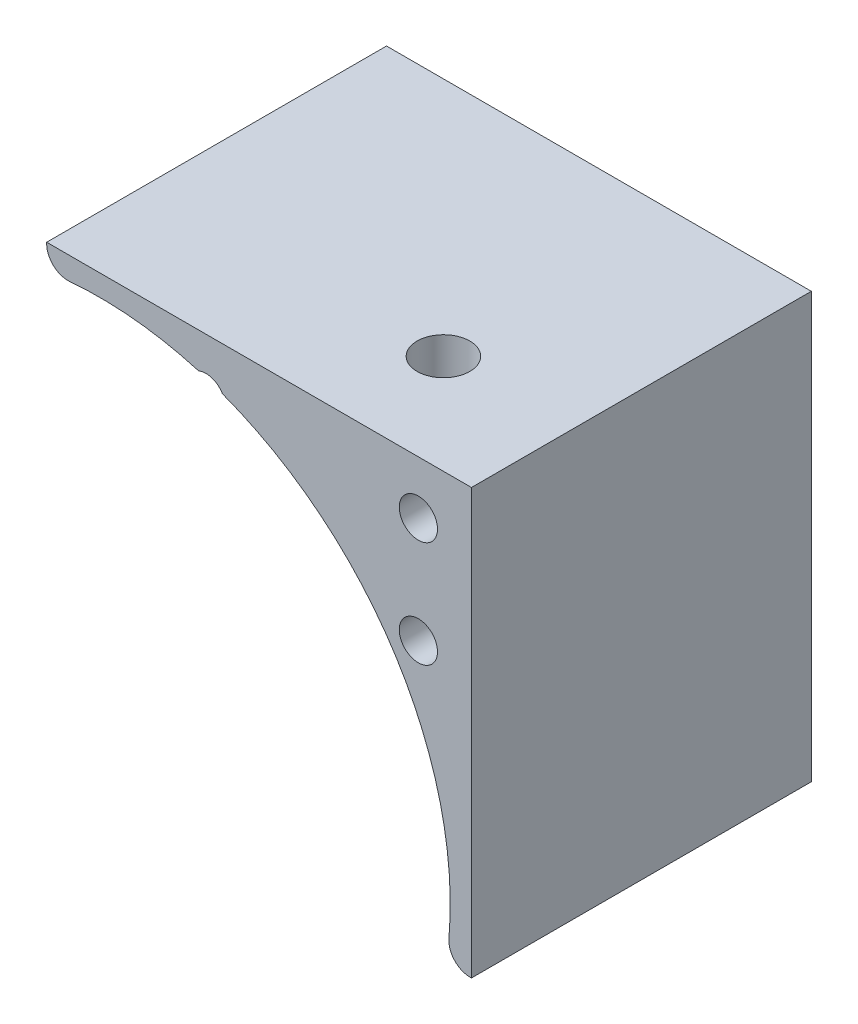
ISO-10303-21;
HEADER;
FILE_DESCRIPTION(('STEP AP214'),'2;1');
FILE_NAME('part.step','',(''),(''),'','','');
FILE_SCHEMA(('AUTOMOTIVE_DESIGN { 1 0 10303 214 1 1 1 1 }'));
ENDSEC;
DATA;
#1=APPLICATION_CONTEXT('core data for automotive mechanical design processes');
#2=APPLICATION_PROTOCOL_DEFINITION('international standard','automotive_design',2000,#1);
#3=PRODUCT_CONTEXT('',#1,'mechanical');
#4=PRODUCT('Part','Part','',(#3));
#5=PRODUCT_RELATED_PRODUCT_CATEGORY('part','',(#4));
#6=PRODUCT_DEFINITION_FORMATION('','',#4);
#7=PRODUCT_DEFINITION_CONTEXT('part definition',#1,'design');
#8=PRODUCT_DEFINITION('design','',#6,#7);
#9=PRODUCT_DEFINITION_SHAPE('','',#8);
#10=(LENGTH_UNIT() NAMED_UNIT(*) SI_UNIT(.MILLI.,.METRE.));
#11=(NAMED_UNIT(*) PLANE_ANGLE_UNIT() SI_UNIT($,.RADIAN.));
#12=(NAMED_UNIT(*) SI_UNIT($,.STERADIAN.) SOLID_ANGLE_UNIT());
#13=UNCERTAINTY_MEASURE_WITH_UNIT(LENGTH_MEASURE(1.E-05),#10,'distance_accuracy_value','');
#14=(GEOMETRIC_REPRESENTATION_CONTEXT(3) GLOBAL_UNCERTAINTY_ASSIGNED_CONTEXT((#13)) GLOBAL_UNIT_ASSIGNED_CONTEXT((#10,
#11,#12)) REPRESENTATION_CONTEXT('',''));
#15=CARTESIAN_POINT('',(0.,0.,0.));
#16=DIRECTION('',(0.,0.,1.));
#17=DIRECTION('',(1.,0.,0.));
#18=AXIS2_PLACEMENT_3D('',#15,#16,#17);
#19=CARTESIAN_POINT('',(6.34999999999708,6.35000000000727,13.97));
#20=DIRECTION('',(0.,0.,1.));
#21=DIRECTION('',(1.,0.,0.));
#22=AXIS2_PLACEMENT_3D('',#19,#20,#21);
#23=CYLINDRICAL_SURFACE('',#22,41.91);
#24=CARTESIAN_POINT('',(6.34999999999708,6.35000000000727,40.64));
#25=DIRECTION('',(0.,0.,-1.));
#26=DIRECTION('',(-1.,0.,0.));
#27=AXIS2_PLACEMENT_3D('',#24,#25,#26);
#28=CIRCLE('',#27,41.91);
#29=CARTESIAN_POINT('',(2.75771428571412,48.1057610797308,40.64));
#30=VERTEX_POINT('',#29);
#31=CARTESIAN_POINT('',(18.168339966931,46.5591400110293,40.64));
#32=VERTEX_POINT('',#31);
#33=EDGE_CURVE('E139',#30,#32,#28,.T.);
#34=ORIENTED_EDGE('',*,*,#33,.F.);
#35=DIRECTION('',(0.,0.,1.));
#36=VECTOR('',#35,1.);
#37=CARTESIAN_POINT('',(2.75771428571412,48.1057610797308,13.97));
#38=LINE('',#37,#36);
#39=CARTESIAN_POINT('',(2.75771428571412,48.1057610797308,13.97));
#40=VERTEX_POINT('',#39);
#41=EDGE_CURVE('E202',#30,#40,#38,.F.);
#42=ORIENTED_EDGE('',*,*,#41,.T.);
#43=CARTESIAN_POINT('',(6.34999999999708,6.35000000000727,13.97));
#44=DIRECTION('',(0.,0.,1.));
#45=DIRECTION('',(1.,0.,0.));
#46=AXIS2_PLACEMENT_3D('',#43,#44,#45);
#47=CIRCLE('',#46,41.91);
#48=CARTESIAN_POINT('',(18.1683399669311,46.5591400110293,13.97));
#49=VERTEX_POINT('',#48);
#50=EDGE_CURVE('E165',#49,#40,#47,.T.);
#51=ORIENTED_EDGE('',*,*,#50,.F.);
#52=DIRECTION('',(0.,0.,-1.));
#53=VECTOR('',#52,1.);
#54=CARTESIAN_POINT('',(18.1683399669311,46.5591400110293,20.32));
#55=LINE('',#54,#53);
#56=EDGE_CURVE('E156',#49,#32,#55,.F.);
#57=ORIENTED_EDGE('',*,*,#56,.T.);
#58=EDGE_LOOP('',(#34,#42,#51,#57));
#59=FACE_BOUND('',#58,.T.);
#60=ADVANCED_FACE('F37',(#59),#23,.F.);
#61=CARTESIAN_POINT('',(0.,0.,40.64));
#62=DIRECTION('',(1.,0.,0.));
#63=DIRECTION('',(0.,0.,-1.));
#64=AXIS2_PLACEMENT_3D('',#61,#62,#63);
#65=PLANE('',#64);
#66=DIRECTION('',(0.,-1.,0.));
#67=VECTOR('',#66,1.);
#68=CARTESIAN_POINT('',(0.,0.,13.97));
#69=LINE('',#68,#67);
#70=CARTESIAN_POINT('',(0.,50.6364132663808,13.97));
#71=VERTEX_POINT('',#70);
#72=CARTESIAN_POINT('',(0.,37.8705710608244,13.97));
#73=VERTEX_POINT('',#72);
#74=EDGE_CURVE('E58',#71,#73,#69,.T.);
#75=ORIENTED_EDGE('',*,*,#74,.F.);
#76=DIRECTION('',(0.,0.,1.));
#77=VECTOR('',#76,1.);
#78=CARTESIAN_POINT('',(0.,50.6364132663808,40.64));
#79=LINE('',#78,#77);
#80=CARTESIAN_POINT('',(0.,50.6364132663808,40.64));
#81=VERTEX_POINT('',#80);
#82=EDGE_CURVE('E200',#71,#81,#79,.T.);
#83=ORIENTED_EDGE('',*,*,#82,.T.);
#84=DIRECTION('',(0.,-1.,0.));
#85=VECTOR('',#84,1.);
#86=CARTESIAN_POINT('',(0.,0.,40.64));
#87=LINE('',#86,#85);
#88=CARTESIAN_POINT('',(0.,50.8,40.64));
#89=VERTEX_POINT('',#88);
#90=EDGE_CURVE('E228',#89,#81,#87,.T.);
#91=ORIENTED_EDGE('',*,*,#90,.F.);
#92=DIRECTION('',(0.,0.,-1.));
#93=VECTOR('',#92,1.);
#94=CARTESIAN_POINT('',(0.,50.8,40.64));
#95=LINE('',#94,#93);
#96=CARTESIAN_POINT('',(0.,50.8,0.));
#97=VERTEX_POINT('',#96);
#98=EDGE_CURVE('E237',#89,#97,#95,.T.);
#99=ORIENTED_EDGE('',*,*,#98,.T.);
#100=DIRECTION('',(0.,-1.,0.));
#101=VECTOR('',#100,1.);
#102=CARTESIAN_POINT('',(0.,0.,0.));
#103=LINE('',#102,#101);
#104=CARTESIAN_POINT('',(0.,37.8705710608244,0.));
#105=VERTEX_POINT('',#104);
#106=EDGE_CURVE('E238',#97,#105,#103,.T.);
#107=ORIENTED_EDGE('',*,*,#106,.T.);
#108=DIRECTION('',(0.,0.,-1.));
#109=VECTOR('',#108,1.);
#110=CARTESIAN_POINT('',(0.,37.8705710608244,40.64));
#111=LINE('',#110,#109);
#112=EDGE_CURVE('E198',#105,#73,#111,.F.);
#113=ORIENTED_EDGE('',*,*,#112,.T.);
#114=EDGE_LOOP('',(#75,#83,#91,#99,#107,#113));
#115=FACE_BOUND('',#114,.T.);
#116=ADVANCED_FACE('F265',(#115),#65,.F.);
#117=CARTESIAN_POINT('',(0.,0.,40.64));
#118=DIRECTION('',(0.,1.,0.));
#119=DIRECTION('',(0.,0.,1.));
#120=AXIS2_PLACEMENT_3D('',#117,#118,#119);
#121=PLANE('',#120);
#122=DIRECTION('',(1.,0.,0.));
#123=VECTOR('',#122,1.);
#124=CARTESIAN_POINT('',(0.,0.,40.64));
#125=LINE('',#124,#123);
#126=CARTESIAN_POINT('',(50.6364132663697,0.,40.64));
#127=VERTEX_POINT('',#126);
#128=CARTESIAN_POINT('',(50.8,0.,40.64));
#129=VERTEX_POINT('',#128);
#130=EDGE_CURVE('E220',#127,#129,#125,.T.);
#131=ORIENTED_EDGE('',*,*,#130,.F.);
#132=DIRECTION('',(0.,0.,1.));
#133=VECTOR('',#132,1.);
#134=CARTESIAN_POINT('',(50.6364132663697,0.,40.64));
#135=LINE('',#134,#133);
#136=CARTESIAN_POINT('',(50.6364132663697,0.,13.97));
#137=VERTEX_POINT('',#136);
#138=EDGE_CURVE('E169',#127,#137,#135,.F.);
#139=ORIENTED_EDGE('',*,*,#138,.T.);
#140=DIRECTION('',(1.,0.,0.));
#141=VECTOR('',#140,1.);
#142=CARTESIAN_POINT('',(0.,0.,13.97));
#143=LINE('',#142,#141);
#144=CARTESIAN_POINT('',(37.870571060813,0.,13.97));
#145=VERTEX_POINT('',#144);
#146=EDGE_CURVE('E150',#145,#137,#143,.T.);
#147=ORIENTED_EDGE('',*,*,#146,.F.);
#148=DIRECTION('',(0.,0.,-1.));
#149=VECTOR('',#148,1.);
#150=CARTESIAN_POINT('',(37.870571060813,0.,40.64));
#151=LINE('',#150,#149);
#152=CARTESIAN_POINT('',(37.870571060813,0.,0.));
#153=VERTEX_POINT('',#152);
#154=EDGE_CURVE('E166',#145,#153,#151,.T.);
#155=ORIENTED_EDGE('',*,*,#154,.T.);
#156=DIRECTION('',(1.,0.,0.));
#157=VECTOR('',#156,1.);
#158=CARTESIAN_POINT('',(0.,0.,0.));
#159=LINE('',#158,#157);
#160=CARTESIAN_POINT('',(50.8,0.,0.));
#161=VERTEX_POINT('',#160);
#162=EDGE_CURVE('E241',#153,#161,#159,.T.);
#163=ORIENTED_EDGE('',*,*,#162,.T.);
#164=DIRECTION('',(0.,0.,-1.));
#165=VECTOR('',#164,1.);
#166=CARTESIAN_POINT('',(50.8,0.,40.64));
#167=LINE('',#166,#165);
#168=EDGE_CURVE('E225',#129,#161,#167,.T.);
#169=ORIENTED_EDGE('',*,*,#168,.F.);
#170=EDGE_LOOP('',(#131,#139,#147,#155,#163,#169));
#171=FACE_BOUND('',#170,.T.);
#172=ADVANCED_FACE('F223',(#171),#121,.F.);
#173=CARTESIAN_POINT('',(50.8,0.,40.64));
#174=DIRECTION('',(-1.,0.,0.));
#175=DIRECTION('',(0.,0.,1.));
#176=AXIS2_PLACEMENT_3D('',#173,#174,#175);
#177=PLANE('',#176);
#178=DIRECTION('',(0.,1.,0.));
#179=VECTOR('',#178,1.);
#180=CARTESIAN_POINT('',(50.8,0.,0.));
#181=LINE('',#180,#179);
#182=CARTESIAN_POINT('',(50.8,50.8,0.));
#183=VERTEX_POINT('',#182);
#184=EDGE_CURVE('E243',#161,#183,#181,.T.);
#185=ORIENTED_EDGE('',*,*,#184,.T.);
#186=DIRECTION('',(0.,0.,-1.));
#187=VECTOR('',#186,1.);
#188=CARTESIAN_POINT('',(50.8,50.8,40.64));
#189=LINE('',#188,#187);
#190=CARTESIAN_POINT('',(50.8,50.8,40.64));
#191=VERTEX_POINT('',#190);
#192=EDGE_CURVE('E248',#191,#183,#189,.T.);
#193=ORIENTED_EDGE('',*,*,#192,.F.);
#194=DIRECTION('',(0.,1.,0.));
#195=VECTOR('',#194,1.);
#196=CARTESIAN_POINT('',(50.8,0.,40.64));
#197=LINE('',#196,#195);
#198=EDGE_CURVE('E227',#129,#191,#197,.T.);
#199=ORIENTED_EDGE('',*,*,#198,.F.);
#200=ORIENTED_EDGE('',*,*,#168,.T.);
#201=EDGE_LOOP('',(#185,#193,#199,#200));
#202=FACE_BOUND('',#201,.T.);
#203=ADVANCED_FACE('F274',(#202),#177,.F.);
#204=CARTESIAN_POINT('',(0.,50.8,40.64));
#205=DIRECTION('',(0.,-1.,0.));
#206=DIRECTION('',(0.,0.,-1.));
#207=AXIS2_PLACEMENT_3D('',#204,#205,#206);
#208=PLANE('',#207);
#209=CARTESIAN_POINT('',(35.5320912711558,50.8,28.7241298478389));
#210=DIRECTION('',(0.,1.,0.));
#211=DIRECTION('',(0.,0.,1.));
#212=AXIS2_PLACEMENT_3D('',#209,#210,#211);
#213=CIRCLE('',#212,3.1543270941562);
#214=CARTESIAN_POINT('',(35.5320912711558,50.8,31.8784569419951));
#215=VERTEX_POINT('',#214);
#216=EDGE_CURVE('E304',#215,#215,#213,.T.);
#217=ORIENTED_EDGE('',*,*,#216,.F.);
#218=EDGE_LOOP('',(#217));
#219=FACE_BOUND('',#218,.T.);
#220=DIRECTION('',(-1.,0.,0.));
#221=VECTOR('',#220,1.);
#222=CARTESIAN_POINT('',(0.,50.8,0.));
#223=LINE('',#222,#221);
#224=EDGE_CURVE('E232',#183,#97,#223,.T.);
#225=ORIENTED_EDGE('',*,*,#224,.T.);
#226=ORIENTED_EDGE('',*,*,#98,.F.);
#227=DIRECTION('',(-1.,0.,0.));
#228=VECTOR('',#227,1.);
#229=CARTESIAN_POINT('',(0.,50.8,40.64));
#230=LINE('',#229,#228);
#231=EDGE_CURVE('E230',#191,#89,#230,.T.);
#232=ORIENTED_EDGE('',*,*,#231,.F.);
#233=ORIENTED_EDGE('',*,*,#192,.T.);
#234=EDGE_LOOP('',(#225,#226,#232,#233));
#235=FACE_BOUND('',#234,.T.);
#236=ADVANCED_FACE('F270',(#219,#235),#208,.F.);
#237=CARTESIAN_POINT('',(0.,0.,40.64));
#238=DIRECTION('',(0.,0.,-1.));
#239=DIRECTION('',(-1.,0.,0.));
#240=AXIS2_PLACEMENT_3D('',#237,#238,#239);
#241=PLANE('',#240);
#242=CARTESIAN_POINT('',(44.4499999999971,44.4500000000073,40.64));
#243=DIRECTION('',(0.,0.,-1.));
#244=DIRECTION('',(-1.,0.,0.));
#245=AXIS2_PLACEMENT_3D('',#242,#243,#244);
#246=CIRCLE('',#245,2.28599999999999);
#247=CARTESIAN_POINT('',(42.1639999999971,44.4500000000073,40.64));
#248=VERTEX_POINT('',#247);
#249=EDGE_CURVE('E320',#248,#248,#246,.T.);
#250=ORIENTED_EDGE('',*,*,#249,.T.);
#251=EDGE_LOOP('',(#250));
#252=FACE_BOUND('',#251,.T.);
#253=CARTESIAN_POINT('',(44.4499999999971,31.7500000000073,40.64));
#254=DIRECTION('',(0.,0.,-1.));
#255=DIRECTION('',(-1.,0.,0.));
#256=AXIS2_PLACEMENT_3D('',#253,#254,#255);
#257=CIRCLE('',#256,2.28599999999999);
#258=CARTESIAN_POINT('',(42.1639999999971,31.7500000000073,40.64));
#259=VERTEX_POINT('',#258);
#260=EDGE_CURVE('E303',#259,#259,#257,.T.);
#261=ORIENTED_EDGE('',*,*,#260,.T.);
#262=EDGE_LOOP('',(#261));
#263=FACE_BOUND('',#262,.T.);
#264=CARTESIAN_POINT('',(21.0208120330631,45.6083159889853,40.64));
#265=VERTEX_POINT('',#264);
#266=CARTESIAN_POINT('',(48.1057610797198,2.7577142857147,40.64));
#267=VERTEX_POINT('',#266);
#268=EDGE_CURVE('E151',#265,#267,#28,.T.);
#269=ORIENTED_EDGE('',*,*,#268,.T.);
#270=CARTESIAN_POINT('',(50.6364132663697,2.54,40.64));
#271=DIRECTION('',(0.,0.,-1.));
#272=DIRECTION('',(-1.,0.,0.));
#273=AXIS2_PLACEMENT_3D('',#270,#271,#272);
#274=CIRCLE('',#273,2.54);
#275=EDGE_CURVE('E185',#267,#127,#274,.F.);
#276=ORIENTED_EDGE('',*,*,#275,.T.);
#277=ORIENTED_EDGE('',*,*,#130,.T.);
#278=ORIENTED_EDGE('',*,*,#198,.T.);
#279=ORIENTED_EDGE('',*,*,#231,.T.);
#280=ORIENTED_EDGE('',*,*,#90,.T.);
#281=CARTESIAN_POINT('',(2.54,50.6364132663808,40.64));
#282=DIRECTION('',(0.,0.,-1.));
#283=DIRECTION('',(-1.,0.,0.));
#284=AXIS2_PLACEMENT_3D('',#281,#282,#283);
#285=CIRCLE('',#284,2.54);
#286=EDGE_CURVE('E146',#81,#30,#285,.F.);
#287=ORIENTED_EDGE('',*,*,#286,.T.);
#288=ORIENTED_EDGE('',*,*,#33,.T.);
#289=CARTESIAN_POINT('',(19.0499999999971,44.4500000000073,40.64));
#290=DIRECTION('',(0.,0.,-1.));
#291=DIRECTION('',(-1.,0.,0.));
#292=AXIS2_PLACEMENT_3D('',#289,#290,#291);
#293=CIRCLE('',#292,2.286);
#294=EDGE_CURVE('E143',#32,#265,#293,.T.);
#295=ORIENTED_EDGE('',*,*,#294,.T.);
#296=EDGE_LOOP('',(#269,#276,#277,#278,#279,#280,#287,#288,#295));
#297=FACE_BOUND('',#296,.T.);
#298=ADVANCED_FACE('F142',(#252,#263,#297),#241,.F.);
#299=CARTESIAN_POINT('',(0.,0.,0.));
#300=DIRECTION('',(0.,0.,-1.));
#301=DIRECTION('',(-1.,0.,0.));
#302=AXIS2_PLACEMENT_3D('',#299,#300,#301);
#303=PLANE('',#302);
#304=CARTESIAN_POINT('',(6.34999999999707,44.4500000000073,0.));
#305=DIRECTION('',(0.,0.,-1.));
#306=DIRECTION('',(-1.,0.,0.));
#307=AXIS2_PLACEMENT_3D('',#304,#305,#306);
#308=CIRCLE('',#307,2.286);
#309=CARTESIAN_POINT('',(4.06399999999707,44.4500000000073,0.));
#310=VERTEX_POINT('',#309);
#311=EDGE_CURVE('E313',#310,#310,#308,.T.);
#312=ORIENTED_EDGE('',*,*,#311,.F.);
#313=EDGE_LOOP('',(#312));
#314=FACE_BOUND('',#313,.T.);
#315=CARTESIAN_POINT('',(19.0499999999971,44.4500000000073,0.));
#316=DIRECTION('',(0.,0.,-1.));
#317=DIRECTION('',(-1.,0.,0.));
#318=AXIS2_PLACEMENT_3D('',#315,#316,#317);
#319=CIRCLE('',#318,2.286);
#320=CARTESIAN_POINT('',(16.7639999999971,44.4500000000073,0.));
#321=VERTEX_POINT('',#320);
#322=EDGE_CURVE('E160',#321,#321,#319,.T.);
#323=ORIENTED_EDGE('',*,*,#322,.F.);
#324=EDGE_LOOP('',(#323));
#325=FACE_BOUND('',#324,.T.);
#326=CARTESIAN_POINT('',(44.4499999999971,44.4500000000073,0.));
#327=DIRECTION('',(0.,0.,-1.));
#328=DIRECTION('',(-1.,0.,0.));
#329=AXIS2_PLACEMENT_3D('',#326,#327,#328);
#330=CIRCLE('',#329,2.28599999999999);
#331=CARTESIAN_POINT('',(42.1639999999971,44.4500000000073,0.));
#332=VERTEX_POINT('',#331);
#333=EDGE_CURVE('E161',#332,#332,#330,.T.);
#334=ORIENTED_EDGE('',*,*,#333,.F.);
#335=EDGE_LOOP('',(#334));
#336=FACE_BOUND('',#335,.T.);
#337=CARTESIAN_POINT('',(44.4499999999971,31.7500000000073,0.));
#338=DIRECTION('',(0.,0.,-1.));
#339=DIRECTION('',(-1.,0.,0.));
#340=AXIS2_PLACEMENT_3D('',#337,#338,#339);
#341=CIRCLE('',#340,2.28599999999999);
#342=CARTESIAN_POINT('',(42.1639999999971,31.7500000000073,0.));
#343=VERTEX_POINT('',#342);
#344=EDGE_CURVE('E306',#343,#343,#341,.T.);
#345=ORIENTED_EDGE('',*,*,#344,.F.);
#346=EDGE_LOOP('',(#345));
#347=FACE_BOUND('',#346,.T.);
#348=ORIENTED_EDGE('',*,*,#162,.F.);
#349=CARTESIAN_POINT('',(37.870571060813,2.54,0.));
#350=DIRECTION('',(0.,0.,-1.));
#351=DIRECTION('',(-1.,0.,0.));
#352=AXIS2_PLACEMENT_3D('',#349,#350,#351);
#353=CIRCLE('',#352,2.54);
#354=CARTESIAN_POINT('',(35.3489253759477,2.84480000000058,0.));
#355=VERTEX_POINT('',#354);
#356=EDGE_CURVE('E189',#153,#355,#353,.T.);
#357=ORIENTED_EDGE('',*,*,#356,.T.);
#358=CARTESIAN_POINT('',(6.34999999999707,6.35000000000727,0.));
#359=DIRECTION('',(0.,0.,-1.));
#360=DIRECTION('',(-1.,0.,0.));
#361=AXIS2_PLACEMENT_3D('',#358,#359,#360);
#362=CIRCLE('',#361,29.21);
#363=CARTESIAN_POINT('',(2.84479999999977,35.348925375959,0.));
#364=VERTEX_POINT('',#363);
#365=EDGE_CURVE('E177',#364,#355,#362,.T.);
#366=ORIENTED_EDGE('',*,*,#365,.F.);
#367=CARTESIAN_POINT('',(2.54,37.8705710608244,0.));
#368=DIRECTION('',(0.,0.,-1.));
#369=DIRECTION('',(-1.,0.,0.));
#370=AXIS2_PLACEMENT_3D('',#367,#368,#369);
#371=CIRCLE('',#370,2.54);
#372=EDGE_CURVE('E187',#364,#105,#371,.T.);
#373=ORIENTED_EDGE('',*,*,#372,.T.);
#374=ORIENTED_EDGE('',*,*,#106,.F.);
#375=ORIENTED_EDGE('',*,*,#224,.F.);
#376=ORIENTED_EDGE('',*,*,#184,.F.);
#377=EDGE_LOOP('',(#348,#357,#366,#373,#374,#375,#376));
#378=FACE_BOUND('',#377,.T.);
#379=ADVANCED_FACE('F263',(#314,#325,#336,#347,#378),#303,.T.);
#380=CARTESIAN_POINT('',(6.34999999999708,6.35000000000727,13.97));
#381=DIRECTION('',(0.,0.,1.));
#382=DIRECTION('',(1.,0.,0.));
#383=AXIS2_PLACEMENT_3D('',#380,#381,#382);
#384=PLANE('',#383);
#385=CARTESIAN_POINT('',(6.34999999999707,44.4500000000073,13.97));
#386=DIRECTION('',(0.,0.,1.));
#387=DIRECTION('',(1.,0.,0.));
#388=AXIS2_PLACEMENT_3D('',#385,#386,#387);
#389=CIRCLE('',#388,2.286);
#390=CARTESIAN_POINT('',(8.63599999999707,44.4500000000073,13.97));
#391=VERTEX_POINT('',#390);
#392=EDGE_CURVE('E175',#391,#391,#389,.T.);
#393=ORIENTED_EDGE('',*,*,#392,.F.);
#394=EDGE_LOOP('',(#393));
#395=FACE_BOUND('',#394,.T.);
#396=CARTESIAN_POINT('',(6.34999999999707,6.35000000000727,13.97));
#397=DIRECTION('',(0.,0.,1.));
#398=DIRECTION('',(1.,0.,0.));
#399=AXIS2_PLACEMENT_3D('',#396,#397,#398);
#400=CIRCLE('',#399,29.21);
#401=CARTESIAN_POINT('',(35.3489253759477,2.84480000000058,13.97));
#402=VERTEX_POINT('',#401);
#403=CARTESIAN_POINT('',(2.84479999999977,35.348925375959,13.97));
#404=VERTEX_POINT('',#403);
#405=EDGE_CURVE('E171',#402,#404,#400,.T.);
#406=ORIENTED_EDGE('',*,*,#405,.F.);
#407=CARTESIAN_POINT('',(37.870571060813,2.54,13.97));
#408=DIRECTION('',(0.,0.,1.));
#409=DIRECTION('',(1.,0.,0.));
#410=AXIS2_PLACEMENT_3D('',#407,#408,#409);
#411=CIRCLE('',#410,2.54);
#412=EDGE_CURVE('E196',#402,#145,#411,.T.);
#413=ORIENTED_EDGE('',*,*,#412,.T.);
#414=ORIENTED_EDGE('',*,*,#146,.T.);
#415=CARTESIAN_POINT('',(50.6364132663697,2.54,13.97));
#416=DIRECTION('',(0.,0.,1.));
#417=DIRECTION('',(1.,0.,0.));
#418=AXIS2_PLACEMENT_3D('',#415,#416,#417);
#419=CIRCLE('',#418,2.54);
#420=CARTESIAN_POINT('',(48.1057610797198,2.7577142857147,13.97));
#421=VERTEX_POINT('',#420);
#422=EDGE_CURVE('E51',#137,#421,#419,.F.);
#423=ORIENTED_EDGE('',*,*,#422,.T.);
#424=CARTESIAN_POINT('',(21.0208120330631,45.6083159889853,13.97));
#425=VERTEX_POINT('',#424);
#426=EDGE_CURVE('E209',#421,#425,#47,.T.);
#427=ORIENTED_EDGE('',*,*,#426,.T.);
#428=CARTESIAN_POINT('',(19.0499999999971,44.4500000000073,13.97));
#429=DIRECTION('',(0.,0.,1.));
#430=DIRECTION('',(1.,0.,0.));
#431=AXIS2_PLACEMENT_3D('',#428,#429,#430);
#432=CIRCLE('',#431,2.286);
#433=EDGE_CURVE('E178',#49,#425,#432,.T.);
#434=ORIENTED_EDGE('',*,*,#433,.F.);
#435=ORIENTED_EDGE('',*,*,#50,.T.);
#436=CARTESIAN_POINT('',(2.54,50.6364132663808,13.97));
#437=DIRECTION('',(0.,0.,1.));
#438=DIRECTION('',(1.,0.,0.));
#439=AXIS2_PLACEMENT_3D('',#436,#437,#438);
#440=CIRCLE('',#439,2.54);
#441=EDGE_CURVE('E11',#40,#71,#440,.F.);
#442=ORIENTED_EDGE('',*,*,#441,.T.);
#443=ORIENTED_EDGE('',*,*,#74,.T.);
#444=CARTESIAN_POINT('',(2.54,37.8705710608244,13.97));
#445=DIRECTION('',(0.,0.,1.));
#446=DIRECTION('',(1.,0.,0.));
#447=AXIS2_PLACEMENT_3D('',#444,#445,#446);
#448=CIRCLE('',#447,2.54);
#449=EDGE_CURVE('E65',#73,#404,#448,.T.);
#450=ORIENTED_EDGE('',*,*,#449,.T.);
#451=EDGE_LOOP('',(#406,#413,#414,#423,#427,#434,#435,#442,#443,#450));
#452=FACE_BOUND('',#451,.T.);
#453=ADVANCED_FACE('F208',(#395,#452),#384,.T.);
#454=CARTESIAN_POINT('',(35.5320912711558,36.4307853794112,31.8784569419951));
#455=CARTESIAN_POINT('',(35.7817263510264,36.1885952977,31.8784635621461));
#456=CARTESIAN_POINT('',(36.0288144257471,35.9427861062805,31.8488889252932));
#457=CARTESIAN_POINT('',(36.3897604856999,35.5748351755104,31.762152449209));
#458=CARTESIAN_POINT('',(36.5086941131495,35.4520623867105,31.7260606887152));
#459=CARTESIAN_POINT('',(36.7425828924408,35.2077103279064,31.6396085322492));
#460=CARTESIAN_POINT('',(36.8575397519648,35.0861305620792,31.5892543483048));
#461=CARTESIAN_POINT('',(37.0561710280796,34.8735889020078,31.487520471564));
#462=CARTESIAN_POINT('',(37.140864805071,34.7821268286126,31.439144656127));
#463=CARTESIAN_POINT('',(37.3069039617084,34.6012521491298,31.3336302222253));
#464=CARTESIAN_POINT('',(37.3882501194989,34.5118390689253,31.2764936549329));
#465=CARTESIAN_POINT('',(37.5468617654834,34.3360304253338,31.1532340702978));
#466=CARTESIAN_POINT('',(37.6241356126862,34.2496288147073,31.087130542922));
#467=CARTESIAN_POINT('',(37.7740129074033,34.0807097798962,30.9454346155898));
#468=CARTESIAN_POINT('',(37.8466184141567,33.9981906474913,30.8698464434152));
#469=CARTESIAN_POINT('',(38.0080519714476,33.8133423941633,30.6834665080476));
#470=CARTESIAN_POINT('',(38.0948803346587,33.7128581211776,30.5690465712599));
#471=CARTESIAN_POINT('',(38.255824641367,33.5250200565505,30.3218572232609));
#472=CARTESIAN_POINT('',(38.3299577430435,33.4376485625115,30.1891130236683));
#473=CARTESIAN_POINT('',(38.4459861124478,33.2999896720802,29.9379906164762));
#474=CARTESIAN_POINT('',(38.4913720310315,33.2457988481264,29.8233881682282));
#475=CARTESIAN_POINT('',(38.5695182632363,33.1521359400237,29.5841096330271));
#476=CARTESIAN_POINT('',(38.6022893857246,33.112651256005,29.4594422814058));
#477=CARTESIAN_POINT('',(38.6401653531782,33.0669180545726,29.2663900388626));
#478=CARTESIAN_POINT('',(38.6509384845397,33.0538884193931,29.2006464927128));
#479=CARTESIAN_POINT('',(38.6683497423089,33.032813942332,29.0678391193269));
#480=CARTESIAN_POINT('',(38.6749900485042,33.0247664727045,29.0007760073619));
#481=CARTESIAN_POINT('',(38.6839513752227,33.0139033078818,28.8659670145061));
#482=CARTESIAN_POINT('',(38.6862743410395,33.0110852564325,28.7982214549516));
#483=CARTESIAN_POINT('',(38.686549619798,33.0107511798553,28.6627314715751));
#484=CARTESIAN_POINT('',(38.6845024511816,33.013234525807,28.5949870485716));
#485=CARTESIAN_POINT('',(38.6731144786396,33.0270412726307,28.4128108467104));
#486=CARTESIAN_POINT('',(38.6596653067145,33.0433430628806,28.2989574072682));
#487=CARTESIAN_POINT('',(38.6212392404817,33.089784936942,28.0762294873965));
#488=CARTESIAN_POINT('',(38.5962567943282,33.1199316853529,27.9673574326608));
#489=CARTESIAN_POINT('',(38.5268283506678,33.2033720655908,27.7230594740826));
#490=CARTESIAN_POINT('',(38.4787235156648,33.2609731224703,27.5901488727964));
#491=CARTESIAN_POINT('',(38.3689747520141,33.3914615496384,27.3381775133715));
#492=CARTESIAN_POINT('',(38.3073040994893,33.4643790795257,27.219144812146));
#493=CARTESIAN_POINT('',(38.1436415087048,33.6563095990691,26.9450141446829));
#494=CARTESIAN_POINT('',(38.0359496815338,33.7813559089848,26.7975853361227));
#495=CARTESIAN_POINT('',(37.8052100504512,34.0456460801365,26.5300425034809));
#496=CARTESIAN_POINT('',(37.6821308332931,34.1849188750687,26.4099858172169));
#497=CARTESIAN_POINT('',(37.4611824680934,34.431339304889,26.2255726578767));
#498=CARTESIAN_POINT('',(37.3660349697106,34.5364253937501,26.1550679158865));
#499=CARTESIAN_POINT('',(37.1708856437894,34.7496828752359,26.0263893376011));
#500=CARTESIAN_POINT('',(37.0708818319095,34.8578555214874,25.9682205949258));
#501=CARTESIAN_POINT('',(36.8667953011341,35.0762191139667,25.8637995664607));
#502=CARTESIAN_POINT('',(36.762709688495,35.1864114614458,25.8175559174297));
#503=CARTESIAN_POINT('',(36.5512054477625,35.4078515691327,25.7368238232633));
#504=CARTESIAN_POINT('',(36.4437872571598,35.5190991894874,25.7023338422066));
#505=CARTESIAN_POINT('',(36.2237875674954,35.7443909747793,25.6444295740947));
#506=CARTESIAN_POINT('',(36.1111444242931,35.8584426132778,25.6212768791223));
#507=CARTESIAN_POINT('',(35.8836506866639,36.0861324359897,25.5873451735525));
#508=CARTESIAN_POINT('',(35.76879988849,36.1997705808791,25.576567310671));
#509=CARTESIAN_POINT('',(35.422034683948,36.5388845228216,25.563252390332));
#510=CARTESIAN_POINT('',(35.187549638867,36.7629265942791,25.5796391443342));
#511=CARTESIAN_POINT('',(34.758926461215,37.1631805655786,25.6596363964284));
#512=CARTESIAN_POINT('',(34.5647110305869,37.3410451361789,25.714738502639));
#513=CARTESIAN_POINT('',(34.1819294862365,37.6852453664567,25.865973417395));
#514=CARTESIAN_POINT('',(33.9933565246622,37.851595351906,25.962054136104));
#515=CARTESIAN_POINT('',(33.6726585380692,38.1297814383548,26.1707406171092));
#516=CARTESIAN_POINT('',(33.5376899541513,38.2452359116462,26.2741420696361));
#517=CARTESIAN_POINT('',(33.2807280238086,38.4624920274213,26.5080056265006));
#518=CARTESIAN_POINT('',(33.1587177425796,38.5643115355989,26.6384317382019));
#519=CARTESIAN_POINT('',(32.9553738528232,38.7323442467814,26.8987022420899));
#520=CARTESIAN_POINT('',(32.8707161024208,38.8016470422737,27.0239500295804));
#521=CARTESIAN_POINT('',(32.7179833844104,38.9258691842024,27.2909084713944));
#522=CARTESIAN_POINT('',(32.6499024346955,38.9807937198923,27.4326131595327));
#523=CARTESIAN_POINT('',(32.5631329038892,39.0504764221471,27.6557006111899));
#524=CARTESIAN_POINT('',(32.5366865578151,39.0716512271967,27.7321775214202));
#525=CARTESIAN_POINT('',(32.4895204637213,39.1093418833581,27.8879767911582));
#526=CARTESIAN_POINT('',(32.4687978111596,39.1258600975885,27.9672976842851));
#527=CARTESIAN_POINT('',(32.4334897680772,39.1539658513441,28.1281249428608));
#528=CARTESIAN_POINT('',(32.4189021327379,39.1655551943733,28.209630497304));
#529=CARTESIAN_POINT('',(32.39614912633,39.1836171711052,28.3740623305676));
#530=CARTESIAN_POINT('',(32.3879828377341,39.1900905358155,28.4569884046834));
#531=CARTESIAN_POINT('',(32.3746724605186,39.2006424959045,28.6852797782479));
#532=CARTESIAN_POINT('',(32.3762518106728,39.1993921381494,28.83137927333));
#533=CARTESIAN_POINT('',(32.3994379528599,39.181007798411,29.1208409593894));
#534=CARTESIAN_POINT('',(32.4210404564549,39.1638772175576,29.2642037297919));
#535=CARTESIAN_POINT('',(32.4817012684283,39.1155872559941,29.5389700342594));
#536=CARTESIAN_POINT('',(32.5200868064894,39.084968250595,29.6706196044915));
#537=CARTESIAN_POINT('',(32.6120536754594,39.0112322851154,29.9247299054901));
#538=CARTESIAN_POINT('',(32.6656378595566,38.9681129783637,30.0471889054796));
#539=CARTESIAN_POINT('',(32.7908300245302,38.8667282045076,30.291189436476));
#540=CARTESIAN_POINT('',(32.8636043060849,38.8074680443337,30.4117144749634));
#541=CARTESIAN_POINT('',(33.0211002998579,38.6781753963348,30.6382289960865));
#542=CARTESIAN_POINT('',(33.1058287322288,38.6081368473005,30.7442102362084));
#543=CARTESIAN_POINT('',(33.3256103328895,38.4248065179666,30.9866360474476));
#544=CARTESIAN_POINT('',(33.4658521527811,38.3064630977793,31.1145901368009));
#545=CARTESIAN_POINT('',(33.7585712115652,38.0557679177525,31.3392032729311));
#546=CARTESIAN_POINT('',(33.9110786005242,37.9233813671276,31.4357820688665));
#547=CARTESIAN_POINT('',(34.2704929306941,37.6064805544998,31.6243027650545));
#548=CARTESIAN_POINT('',(34.4797506040946,37.4184227529762,31.7057574180272));
#549=CARTESIAN_POINT('',(34.9007258580832,37.0320103463033,31.8223255931224));
#550=CARTESIAN_POINT('',(35.1124396473997,36.8336703020767,31.8575028818737));
#551=CARTESIAN_POINT('',(35.3925503128879,36.5656903562142,31.8761490847362));
#552=CARTESIAN_POINT('',(35.4624199884903,36.4983788188045,31.8784550943605));
#553=CARTESIAN_POINT('',(35.5320912711558,36.4307853794112,31.8784569419951));
#554=B_SPLINE_CURVE_WITH_KNOTS('',3,(#454,#455,#456,#457,#458,#459,#460,#461,#462,#463,#464,
#465,#466,#467,#468,#469,#470,#471,#472,#473,#474,#475,#476,#477,#478,#479,#480,#481,#482,#483,
#484,#485,#486,#487,#488,#489,#490,#491,#492,#493,#494,#495,#496,#497,#498,#499,#500,#501,#502,
#503,#504,#505,#506,#507,#508,#509,#510,#511,#512,#513,#514,#515,#516,#517,#518,#519,#520,#521,
#522,#523,#524,#525,#526,#527,#528,#529,#530,#531,#532,#533,#534,#535,#536,#537,#538,#539,#540,
#541,#542,#543,#544,#545,#546,#547,#548,#549,#550,#551,#552,#553),.UNSPECIFIED.,.T.,.F.,(4,2,2,
2,2,2,2,2,2,2,2,2,2,2,2,2,2,2,2,2,2,2,2,2,2,2,2,2,2,2,2,2,2,2,2,2,2,2,2,2,2,2,2,2,2,2,2,2,2,4),
(0.,1.04310447378057,1.5667973457653,2.09026247206826,2.49109390762289,2.89183163861142,
3.29171190802159,3.69141455976946,4.21573382611299,4.73933876224532,5.14186905889626,
5.54405367948615,5.74742954966974,5.95069806163898,6.15387496329655,6.35702776282051,
6.70266004987279,7.04845888990806,7.50381428950529,7.96007487683139,8.62032626586649,
9.28194826443691,9.75634898314796,10.2309452054705,10.7058841952015,11.1807610980296,
11.666131800278,12.151547515078,13.1208318468887,13.925213404239,14.7285755076773,
15.3429539630664,15.9565193618355,16.4535230097967,16.9503470362412,17.2009699737132,
17.451465495584,17.7018692805884,17.9522372796348,18.3881285401018,18.823926465584,
19.2436609046074,19.6634741911108,20.119995532036,20.5767745414846,21.2442022700376,
21.9133239262818,22.787460184123,23.6603906838056,23.9515133364395),.UNSPECIFIED.);
#555=CARTESIAN_POINT('',(35.5320912711558,36.4307853794112,31.8784569419951));
#556=VERTEX_POINT('',#555);
#557=EDGE_CURVE('E41',#556,#556,#554,.T.);
#558=ORIENTED_EDGE('',*,*,#557,.T.);
#559=EDGE_LOOP('',(#558));
#560=FACE_BOUND('',#559,.T.);
#561=ORIENTED_EDGE('',*,*,#426,.F.);
#562=DIRECTION('',(0.,0.,1.));
#563=VECTOR('',#562,1.);
#564=CARTESIAN_POINT('',(48.1057610797198,2.7577142857147,13.97));
#565=LINE('',#564,#563);
#566=EDGE_CURVE('E182',#421,#267,#565,.T.);
#567=ORIENTED_EDGE('',*,*,#566,.T.);
#568=ORIENTED_EDGE('',*,*,#268,.F.);
#569=DIRECTION('',(0.,0.,-1.));
#570=VECTOR('',#569,1.);
#571=CARTESIAN_POINT('',(21.0208120330631,45.6083159889853,20.32));
#572=LINE('',#571,#570);
#573=EDGE_CURVE('E159',#265,#425,#572,.T.);
#574=ORIENTED_EDGE('',*,*,#573,.T.);
#575=EDGE_LOOP('',(#561,#567,#568,#574));
#576=FACE_BOUND('',#575,.T.);
#577=ADVANCED_FACE('F215',(#560,#576),#23,.F.);
#578=CARTESIAN_POINT('',(6.34999999999707,6.35000000000727,40.64));
#579=DIRECTION('',(0.,0.,-1.));
#580=DIRECTION('',(-1.,0.,0.));
#581=AXIS2_PLACEMENT_3D('',#578,#579,#580);
#582=CYLINDRICAL_SURFACE('',#581,29.21);
#583=ORIENTED_EDGE('',*,*,#365,.T.);
#584=DIRECTION('',(0.,0.,-1.));
#585=VECTOR('',#584,1.);
#586=CARTESIAN_POINT('',(35.3489253759477,2.84480000000058,40.64));
#587=LINE('',#586,#585);
#588=EDGE_CURVE('E193',#355,#402,#587,.F.);
#589=ORIENTED_EDGE('',*,*,#588,.T.);
#590=ORIENTED_EDGE('',*,*,#405,.T.);
#591=DIRECTION('',(0.,0.,-1.));
#592=VECTOR('',#591,1.);
#593=CARTESIAN_POINT('',(2.84479999999977,35.348925375959,40.64));
#594=LINE('',#593,#592);
#595=EDGE_CURVE('E191',#404,#364,#594,.T.);
#596=ORIENTED_EDGE('',*,*,#595,.T.);
#597=EDGE_LOOP('',(#583,#589,#590,#596));
#598=FACE_BOUND('',#597,.T.);
#599=ADVANCED_FACE('F255',(#598),#582,.F.);
#600=CARTESIAN_POINT('',(19.0499999999971,44.4500000000073,40.64));
#601=DIRECTION('',(0.,0.,-1.));
#602=DIRECTION('',(-1.,0.,0.));
#603=AXIS2_PLACEMENT_3D('',#600,#601,#602);
#604=CYLINDRICAL_SURFACE('',#603,2.286);
#605=ORIENTED_EDGE('',*,*,#322,.T.);
#606=EDGE_LOOP('',(#605));
#607=FACE_BOUND('',#606,.T.);
#608=ORIENTED_EDGE('',*,*,#433,.T.);
#609=ORIENTED_EDGE('',*,*,#573,.F.);
#610=ORIENTED_EDGE('',*,*,#294,.F.);
#611=ORIENTED_EDGE('',*,*,#56,.F.);
#612=EDGE_LOOP('',(#608,#609,#610,#611));
#613=FACE_BOUND('',#612,.T.);
#614=ADVANCED_FACE('F155',(#607,#613),#604,.F.);
#615=CARTESIAN_POINT('',(6.34999999999707,44.4500000000073,40.64));
#616=DIRECTION('',(0.,0.,-1.));
#617=DIRECTION('',(-1.,0.,0.));
#618=AXIS2_PLACEMENT_3D('',#615,#616,#617);
#619=CYLINDRICAL_SURFACE('',#618,2.286);
#620=ORIENTED_EDGE('',*,*,#392,.T.);
#621=EDGE_LOOP('',(#620));
#622=FACE_BOUND('',#621,.T.);
#623=ORIENTED_EDGE('',*,*,#311,.T.);
#624=EDGE_LOOP('',(#623));
#625=FACE_BOUND('',#624,.T.);
#626=ADVANCED_FACE('F351',(#622,#625),#619,.F.);
#627=CARTESIAN_POINT('',(44.4499999999971,31.7500000000073,40.64));
#628=DIRECTION('',(0.,0.,-1.));
#629=DIRECTION('',(-1.,0.,0.));
#630=AXIS2_PLACEMENT_3D('',#627,#628,#629);
#631=CYLINDRICAL_SURFACE('',#630,2.28599999999999);
#632=ORIENTED_EDGE('',*,*,#260,.F.);
#633=EDGE_LOOP('',(#632));
#634=FACE_BOUND('',#633,.T.);
#635=ORIENTED_EDGE('',*,*,#344,.T.);
#636=EDGE_LOOP('',(#635));
#637=FACE_BOUND('',#636,.T.);
#638=ADVANCED_FACE('F345',(#634,#637),#631,.F.);
#639=CARTESIAN_POINT('',(44.4499999999971,44.4500000000073,40.64));
#640=DIRECTION('',(0.,0.,-1.));
#641=DIRECTION('',(-1.,0.,0.));
#642=AXIS2_PLACEMENT_3D('',#639,#640,#641);
#643=CYLINDRICAL_SURFACE('',#642,2.28599999999999);
#644=ORIENTED_EDGE('',*,*,#249,.F.);
#645=EDGE_LOOP('',(#644));
#646=FACE_BOUND('',#645,.T.);
#647=ORIENTED_EDGE('',*,*,#333,.T.);
#648=EDGE_LOOP('',(#647));
#649=FACE_BOUND('',#648,.T.);
#650=ADVANCED_FACE('F341',(#646,#649),#643,.F.);
#651=CARTESIAN_POINT('',(50.6364132663697,2.54,13.97));
#652=DIRECTION('',(0.,0.,1.));
#653=DIRECTION('',(1.,0.,0.));
#654=AXIS2_PLACEMENT_3D('',#651,#652,#653);
#655=CYLINDRICAL_SURFACE('',#654,2.54);
#656=ORIENTED_EDGE('',*,*,#275,.F.);
#657=ORIENTED_EDGE('',*,*,#566,.F.);
#658=ORIENTED_EDGE('',*,*,#422,.F.);
#659=ORIENTED_EDGE('',*,*,#138,.F.);
#660=EDGE_LOOP('',(#656,#657,#658,#659));
#661=FACE_BOUND('',#660,.T.);
#662=ADVANCED_FACE('F218',(#661),#655,.T.);
#663=CARTESIAN_POINT('',(37.870571060813,2.54,40.64));
#664=DIRECTION('',(0.,0.,-1.));
#665=DIRECTION('',(-1.,0.,0.));
#666=AXIS2_PLACEMENT_3D('',#663,#664,#665);
#667=CYLINDRICAL_SURFACE('',#666,2.54);
#668=ORIENTED_EDGE('',*,*,#412,.F.);
#669=ORIENTED_EDGE('',*,*,#588,.F.);
#670=ORIENTED_EDGE('',*,*,#356,.F.);
#671=ORIENTED_EDGE('',*,*,#154,.F.);
#672=EDGE_LOOP('',(#668,#669,#670,#671));
#673=FACE_BOUND('',#672,.T.);
#674=ADVANCED_FACE('F331',(#673),#667,.T.);
#675=CARTESIAN_POINT('',(2.54,50.6364132663808,13.97));
#676=DIRECTION('',(0.,0.,1.));
#677=DIRECTION('',(1.,0.,0.));
#678=AXIS2_PLACEMENT_3D('',#675,#676,#677);
#679=CYLINDRICAL_SURFACE('',#678,2.54);
#680=ORIENTED_EDGE('',*,*,#441,.F.);
#681=ORIENTED_EDGE('',*,*,#41,.F.);
#682=ORIENTED_EDGE('',*,*,#286,.F.);
#683=ORIENTED_EDGE('',*,*,#82,.F.);
#684=EDGE_LOOP('',(#680,#681,#682,#683));
#685=FACE_BOUND('',#684,.T.);
#686=ADVANCED_FACE('F329',(#685),#679,.T.);
#687=CARTESIAN_POINT('',(2.54,37.8705710608244,40.64));
#688=DIRECTION('',(0.,0.,-1.));
#689=DIRECTION('',(-1.,0.,0.));
#690=AXIS2_PLACEMENT_3D('',#687,#688,#689);
#691=CYLINDRICAL_SURFACE('',#690,2.54);
#692=ORIENTED_EDGE('',*,*,#372,.F.);
#693=ORIENTED_EDGE('',*,*,#595,.F.);
#694=ORIENTED_EDGE('',*,*,#449,.F.);
#695=ORIENTED_EDGE('',*,*,#112,.F.);
#696=EDGE_LOOP('',(#692,#693,#694,#695));
#697=FACE_BOUND('',#696,.T.);
#698=ADVANCED_FACE('F39',(#697),#691,.T.);
#699=CARTESIAN_POINT('',(35.5320912711558,0.,28.7241298478389));
#700=DIRECTION('',(0.,1.,0.));
#701=DIRECTION('',(0.,0.,1.));
#702=AXIS2_PLACEMENT_3D('',#699,#700,#701);
#703=CYLINDRICAL_SURFACE('',#702,3.1543270941562);
#704=ORIENTED_EDGE('',*,*,#216,.T.);
#705=EDGE_LOOP('',(#704));
#706=FACE_BOUND('',#705,.T.);
#707=ORIENTED_EDGE('',*,*,#557,.F.);
#708=EDGE_LOOP('',(#707));
#709=FACE_BOUND('',#708,.T.);
#710=ADVANCED_FACE('F336',(#706,#709),#703,.F.);
#711=CLOSED_SHELL('',(#60,#116,#172,#203,#236,#298,#379,#453,#577,#599,#614,#626,#638,#650,#662,
#674,#686,#698,#710));
#712=MANIFOLD_SOLID_BREP('B2',#711);
#713=ADVANCED_BREP_SHAPE_REPRESENTATION('',(#18,#712),#14);
#714=SHAPE_DEFINITION_REPRESENTATION(#9,#713);
ENDSEC;
END-ISO-10303-21;
